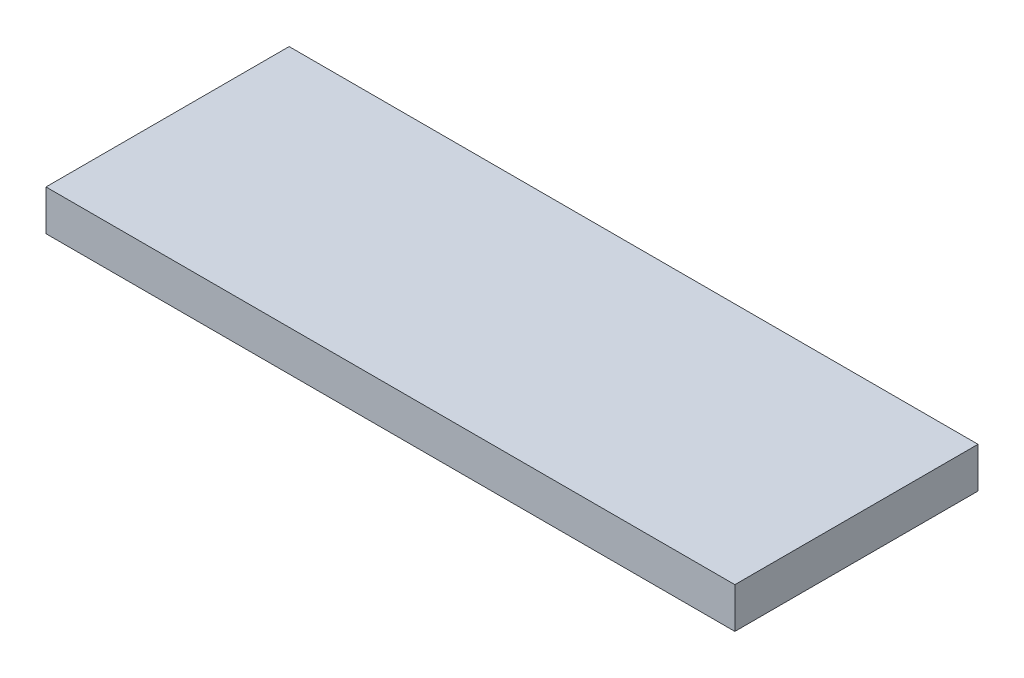
ISO-10303-21;
HEADER;
FILE_DESCRIPTION(('STEP AP214'),'2;1');
FILE_NAME('part.step','',(''),(''),'','','');
FILE_SCHEMA(('AUTOMOTIVE_DESIGN { 1 0 10303 214 1 1 1 1 }'));
ENDSEC;
DATA;
#1=APPLICATION_CONTEXT('core data for automotive mechanical design processes');
#2=APPLICATION_PROTOCOL_DEFINITION('international standard','automotive_design',2000,#1);
#3=PRODUCT_CONTEXT('',#1,'mechanical');
#4=PRODUCT('Part','Part','',(#3));
#5=PRODUCT_RELATED_PRODUCT_CATEGORY('part','',(#4));
#6=PRODUCT_DEFINITION_FORMATION('','',#4);
#7=PRODUCT_DEFINITION_CONTEXT('part definition',#1,'design');
#8=PRODUCT_DEFINITION('design','',#6,#7);
#9=PRODUCT_DEFINITION_SHAPE('','',#8);
#10=(LENGTH_UNIT() NAMED_UNIT(*) SI_UNIT(.MILLI.,.METRE.));
#11=(NAMED_UNIT(*) PLANE_ANGLE_UNIT() SI_UNIT($,.RADIAN.));
#12=(NAMED_UNIT(*) SI_UNIT($,.STERADIAN.) SOLID_ANGLE_UNIT());
#13=UNCERTAINTY_MEASURE_WITH_UNIT(LENGTH_MEASURE(1.E-05),#10,'distance_accuracy_value','');
#14=(GEOMETRIC_REPRESENTATION_CONTEXT(3) GLOBAL_UNCERTAINTY_ASSIGNED_CONTEXT((#13)) GLOBAL_UNIT_ASSIGNED_CONTEXT((#10,
#11,#12)) REPRESENTATION_CONTEXT('',''));
#15=CARTESIAN_POINT('',(0.,0.,0.));
#16=DIRECTION('',(0.,0.,1.));
#17=DIRECTION('',(1.,0.,0.));
#18=AXIS2_PLACEMENT_3D('',#15,#16,#17);
#19=CARTESIAN_POINT('',(0.,5.,0.));
#20=DIRECTION('',(1.,0.,0.));
#21=DIRECTION('',(0.,0.,-1.));
#22=AXIS2_PLACEMENT_3D('',#19,#20,#21);
#23=PLANE('',#22);
#24=DIRECTION('',(0.,0.,1.));
#25=VECTOR('',#24,1.);
#26=CARTESIAN_POINT('',(0.,0.,0.));
#27=LINE('',#26,#25);
#28=CARTESIAN_POINT('',(0.,0.,-30.));
#29=VERTEX_POINT('',#28);
#30=CARTESIAN_POINT('',(0.,0.,0.));
#31=VERTEX_POINT('',#30);
#32=EDGE_CURVE('E108',#29,#31,#27,.T.);
#33=ORIENTED_EDGE('',*,*,#32,.T.);
#34=DIRECTION('',(0.,-1.,0.));
#35=VECTOR('',#34,1.);
#36=CARTESIAN_POINT('',(0.,5.,0.));
#37=LINE('',#36,#35);
#38=CARTESIAN_POINT('',(0.,5.,0.));
#39=VERTEX_POINT('',#38);
#40=EDGE_CURVE('E11',#39,#31,#37,.T.);
#41=ORIENTED_EDGE('',*,*,#40,.F.);
#42=DIRECTION('',(0.,0.,1.));
#43=VECTOR('',#42,1.);
#44=CARTESIAN_POINT('',(0.,5.,0.));
#45=LINE('',#44,#43);
#46=CARTESIAN_POINT('',(0.,5.,-30.));
#47=VERTEX_POINT('',#46);
#48=EDGE_CURVE('E92',#47,#39,#45,.T.);
#49=ORIENTED_EDGE('',*,*,#48,.F.);
#50=DIRECTION('',(0.,-1.,0.));
#51=VECTOR('',#50,1.);
#52=CARTESIAN_POINT('',(0.,5.,-30.));
#53=LINE('',#52,#51);
#54=EDGE_CURVE('E104',#47,#29,#53,.T.);
#55=ORIENTED_EDGE('',*,*,#54,.T.);
#56=EDGE_LOOP('',(#33,#41,#49,#55));
#57=FACE_BOUND('',#56,.T.);
#58=ADVANCED_FACE('F40',(#57),#23,.F.);
#59=CARTESIAN_POINT('',(0.,5.,0.));
#60=DIRECTION('',(0.,0.,-1.));
#61=DIRECTION('',(-1.,0.,0.));
#62=AXIS2_PLACEMENT_3D('',#59,#60,#61);
#63=PLANE('',#62);
#64=DIRECTION('',(1.,0.,0.));
#65=VECTOR('',#64,1.);
#66=CARTESIAN_POINT('',(0.,0.,0.));
#67=LINE('',#66,#65);
#68=CARTESIAN_POINT('',(85.,0.,0.));
#69=VERTEX_POINT('',#68);
#70=EDGE_CURVE('E97',#31,#69,#67,.T.);
#71=ORIENTED_EDGE('',*,*,#70,.T.);
#72=DIRECTION('',(0.,-1.,0.));
#73=VECTOR('',#72,1.);
#74=CARTESIAN_POINT('',(85.,5.,0.));
#75=LINE('',#74,#73);
#76=CARTESIAN_POINT('',(85.,5.,0.));
#77=VERTEX_POINT('',#76);
#78=EDGE_CURVE('E49',#77,#69,#75,.T.);
#79=ORIENTED_EDGE('',*,*,#78,.F.);
#80=DIRECTION('',(1.,0.,0.));
#81=VECTOR('',#80,1.);
#82=CARTESIAN_POINT('',(0.,5.,0.));
#83=LINE('',#82,#81);
#84=EDGE_CURVE('E87',#39,#77,#83,.T.);
#85=ORIENTED_EDGE('',*,*,#84,.F.);
#86=ORIENTED_EDGE('',*,*,#40,.T.);
#87=EDGE_LOOP('',(#71,#79,#85,#86));
#88=FACE_BOUND('',#87,.T.);
#89=ADVANCED_FACE('F96',(#88),#63,.F.);
#90=CARTESIAN_POINT('',(85.,5.,0.));
#91=DIRECTION('',(-1.,0.,0.));
#92=DIRECTION('',(0.,0.,1.));
#93=AXIS2_PLACEMENT_3D('',#90,#91,#92);
#94=PLANE('',#93);
#95=DIRECTION('',(0.,0.,-1.));
#96=VECTOR('',#95,1.);
#97=CARTESIAN_POINT('',(85.,0.,0.));
#98=LINE('',#97,#96);
#99=CARTESIAN_POINT('',(85.,0.,-30.));
#100=VERTEX_POINT('',#99);
#101=EDGE_CURVE('E74',#69,#100,#98,.T.);
#102=ORIENTED_EDGE('',*,*,#101,.T.);
#103=DIRECTION('',(0.,-1.,0.));
#104=VECTOR('',#103,1.);
#105=CARTESIAN_POINT('',(85.,5.,-30.));
#106=LINE('',#105,#104);
#107=CARTESIAN_POINT('',(85.,5.,-30.));
#108=VERTEX_POINT('',#107);
#109=EDGE_CURVE('E99',#108,#100,#106,.T.);
#110=ORIENTED_EDGE('',*,*,#109,.F.);
#111=DIRECTION('',(0.,0.,-1.));
#112=VECTOR('',#111,1.);
#113=CARTESIAN_POINT('',(85.,5.,0.));
#114=LINE('',#113,#112);
#115=EDGE_CURVE('E90',#77,#108,#114,.T.);
#116=ORIENTED_EDGE('',*,*,#115,.F.);
#117=ORIENTED_EDGE('',*,*,#78,.T.);
#118=EDGE_LOOP('',(#102,#110,#116,#117));
#119=FACE_BOUND('',#118,.T.);
#120=ADVANCED_FACE('F100',(#119),#94,.F.);
#121=CARTESIAN_POINT('',(0.,5.,-30.));
#122=DIRECTION('',(0.,0.,1.));
#123=DIRECTION('',(1.,0.,0.));
#124=AXIS2_PLACEMENT_3D('',#121,#122,#123);
#125=PLANE('',#124);
#126=DIRECTION('',(-1.,0.,0.));
#127=VECTOR('',#126,1.);
#128=CARTESIAN_POINT('',(0.,0.,-30.));
#129=LINE('',#128,#127);
#130=EDGE_CURVE('E80',#100,#29,#129,.T.);
#131=ORIENTED_EDGE('',*,*,#130,.T.);
#132=ORIENTED_EDGE('',*,*,#54,.F.);
#133=DIRECTION('',(-1.,0.,0.));
#134=VECTOR('',#133,1.);
#135=CARTESIAN_POINT('',(0.,5.,-30.));
#136=LINE('',#135,#134);
#137=EDGE_CURVE('E57',#108,#47,#136,.T.);
#138=ORIENTED_EDGE('',*,*,#137,.F.);
#139=ORIENTED_EDGE('',*,*,#109,.T.);
#140=EDGE_LOOP('',(#131,#132,#138,#139));
#141=FACE_BOUND('',#140,.T.);
#142=ADVANCED_FACE('F121',(#141),#125,.F.);
#143=CARTESIAN_POINT('',(0.,5.,0.));
#144=DIRECTION('',(0.,-1.,0.));
#145=DIRECTION('',(0.,0.,-1.));
#146=AXIS2_PLACEMENT_3D('',#143,#144,#145);
#147=PLANE('',#146);
#148=ORIENTED_EDGE('',*,*,#48,.T.);
#149=ORIENTED_EDGE('',*,*,#84,.T.);
#150=ORIENTED_EDGE('',*,*,#115,.T.);
#151=ORIENTED_EDGE('',*,*,#137,.T.);
#152=EDGE_LOOP('',(#148,#149,#150,#151));
#153=FACE_BOUND('',#152,.T.);
#154=ADVANCED_FACE('F88',(#153),#147,.F.);
#155=CARTESIAN_POINT('',(0.,0.,0.));
#156=DIRECTION('',(0.,-1.,0.));
#157=DIRECTION('',(0.,0.,-1.));
#158=AXIS2_PLACEMENT_3D('',#155,#156,#157);
#159=PLANE('',#158);
#160=ORIENTED_EDGE('',*,*,#32,.F.);
#161=ORIENTED_EDGE('',*,*,#130,.F.);
#162=ORIENTED_EDGE('',*,*,#101,.F.);
#163=ORIENTED_EDGE('',*,*,#70,.F.);
#164=EDGE_LOOP('',(#160,#161,#162,#163));
#165=FACE_BOUND('',#164,.T.);
#166=ADVANCED_FACE('F124',(#165),#159,.T.);
#167=CLOSED_SHELL('',(#58,#89,#120,#142,#154,#166));
#168=MANIFOLD_SOLID_BREP('B2',#167);
#169=ADVANCED_BREP_SHAPE_REPRESENTATION('',(#18,#168),#14);
#170=SHAPE_DEFINITION_REPRESENTATION(#9,#169);
ENDSEC;
END-ISO-10303-21;
